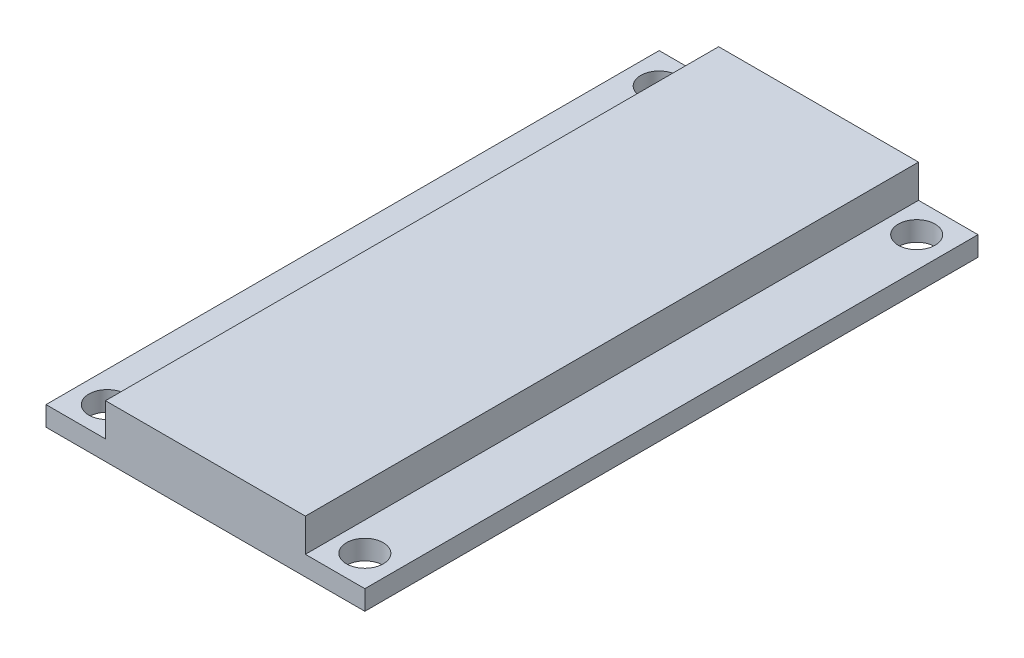
ISO-10303-21;
HEADER;
FILE_DESCRIPTION(('STEP AP214'),'2;1');
FILE_NAME('part.step','',(''),(''),'','','');
FILE_SCHEMA(('AUTOMOTIVE_DESIGN { 1 0 10303 214 1 1 1 1 }'));
ENDSEC;
DATA;
#1=APPLICATION_CONTEXT('core data for automotive mechanical design processes');
#2=APPLICATION_PROTOCOL_DEFINITION('international standard','automotive_design',2000,#1);
#3=PRODUCT_CONTEXT('',#1,'mechanical');
#4=PRODUCT('Part','Part','',(#3));
#5=PRODUCT_RELATED_PRODUCT_CATEGORY('part','',(#4));
#6=PRODUCT_DEFINITION_FORMATION('','',#4);
#7=PRODUCT_DEFINITION_CONTEXT('part definition',#1,'design');
#8=PRODUCT_DEFINITION('design','',#6,#7);
#9=PRODUCT_DEFINITION_SHAPE('','',#8);
#10=(LENGTH_UNIT() NAMED_UNIT(*) SI_UNIT(.MILLI.,.METRE.));
#11=(NAMED_UNIT(*) PLANE_ANGLE_UNIT() SI_UNIT($,.RADIAN.));
#12=(NAMED_UNIT(*) SI_UNIT($,.STERADIAN.) SOLID_ANGLE_UNIT());
#13=UNCERTAINTY_MEASURE_WITH_UNIT(LENGTH_MEASURE(1.E-05),#10,'distance_accuracy_value','');
#14=(GEOMETRIC_REPRESENTATION_CONTEXT(3) GLOBAL_UNCERTAINTY_ASSIGNED_CONTEXT((#13)) GLOBAL_UNIT_ASSIGNED_CONTEXT((#10,
#11,#12)) REPRESENTATION_CONTEXT('',''));
#15=CARTESIAN_POINT('',(0.,0.,0.));
#16=DIRECTION('',(0.,0.,1.));
#17=DIRECTION('',(1.,0.,0.));
#18=AXIS2_PLACEMENT_3D('',#15,#16,#17);
#19=CARTESIAN_POINT('',(0.,1.6,0.));
#20=DIRECTION('',(0.,-1.,0.));
#21=DIRECTION('',(0.,0.,-1.));
#22=AXIS2_PLACEMENT_3D('',#19,#20,#21);
#23=PLANE('',#22);
#24=CARTESIAN_POINT('',(2.5,1.6,-2.5));
#25=DIRECTION('',(0.,1.,0.));
#26=DIRECTION('',(0.,0.,1.));
#27=AXIS2_PLACEMENT_3D('',#24,#25,#26);
#28=CIRCLE('',#27,1.5);
#29=CARTESIAN_POINT('',(2.5,1.6,-1.));
#30=VERTEX_POINT('',#29);
#31=EDGE_CURVE('E138',#30,#30,#28,.T.);
#32=ORIENTED_EDGE('',*,*,#31,.F.);
#33=EDGE_LOOP('',(#32));
#34=FACE_BOUND('',#33,.T.);
#35=CARTESIAN_POINT('',(2.5,1.6,-47.5));
#36=DIRECTION('',(0.,1.,0.));
#37=DIRECTION('',(0.,0.,-1.));
#38=AXIS2_PLACEMENT_3D('',#35,#36,#37);
#39=CIRCLE('',#38,1.5);
#40=CARTESIAN_POINT('',(2.5,1.6,-49.));
#41=VERTEX_POINT('',#40);
#42=EDGE_CURVE('E126',#41,#41,#39,.T.);
#43=ORIENTED_EDGE('',*,*,#42,.F.);
#44=EDGE_LOOP('',(#43));
#45=FACE_BOUND('',#44,.T.);
#46=DIRECTION('',(0.,0.,1.));
#47=VECTOR('',#46,1.);
#48=CARTESIAN_POINT('',(4.85,1.6,-50.));
#49=LINE('',#48,#47);
#50=CARTESIAN_POINT('',(4.85,1.6,-50.));
#51=VERTEX_POINT('',#50);
#52=CARTESIAN_POINT('',(4.85,1.6,0.));
#53=VERTEX_POINT('',#52);
#54=EDGE_CURVE('E53',#51,#53,#49,.T.);
#55=ORIENTED_EDGE('',*,*,#54,.F.);
#56=DIRECTION('',(-1.,0.,0.));
#57=VECTOR('',#56,1.);
#58=CARTESIAN_POINT('',(0.,1.6,-50.));
#59=LINE('',#58,#57);
#60=CARTESIAN_POINT('',(0.,1.6,-50.));
#61=VERTEX_POINT('',#60);
#62=EDGE_CURVE('E168',#51,#61,#59,.T.);
#63=ORIENTED_EDGE('',*,*,#62,.T.);
#64=DIRECTION('',(0.,0.,1.));
#65=VECTOR('',#64,1.);
#66=CARTESIAN_POINT('',(0.,1.6,0.));
#67=LINE('',#66,#65);
#68=CARTESIAN_POINT('',(0.,1.6,0.));
#69=VERTEX_POINT('',#68);
#70=EDGE_CURVE('E158',#61,#69,#67,.T.);
#71=ORIENTED_EDGE('',*,*,#70,.T.);
#72=DIRECTION('',(1.,0.,0.));
#73=VECTOR('',#72,1.);
#74=CARTESIAN_POINT('',(0.,1.6,0.));
#75=LINE('',#74,#73);
#76=EDGE_CURVE('E163',#69,#53,#75,.T.);
#77=ORIENTED_EDGE('',*,*,#76,.T.);
#78=EDGE_LOOP('',(#55,#63,#71,#77));
#79=FACE_BOUND('',#78,.T.);
#80=ADVANCED_FACE('F38',(#34,#45,#79),#23,.F.);
#81=CARTESIAN_POINT('',(23.5,1.6,-2.5));
#82=DIRECTION('',(0.,1.,0.));
#83=DIRECTION('',(0.,0.,-1.));
#84=AXIS2_PLACEMENT_3D('',#81,#82,#83);
#85=CIRCLE('',#84,1.5);
#86=CARTESIAN_POINT('',(23.5,1.6,-4.));
#87=VERTEX_POINT('',#86);
#88=EDGE_CURVE('E139',#87,#87,#85,.T.);
#89=ORIENTED_EDGE('',*,*,#88,.F.);
#90=EDGE_LOOP('',(#89));
#91=FACE_BOUND('',#90,.T.);
#92=CARTESIAN_POINT('',(23.5,1.6,-47.5));
#93=DIRECTION('',(0.,1.,0.));
#94=DIRECTION('',(0.,0.,1.));
#95=AXIS2_PLACEMENT_3D('',#92,#93,#94);
#96=CIRCLE('',#95,1.5);
#97=CARTESIAN_POINT('',(23.5,1.6,-46.));
#98=VERTEX_POINT('',#97);
#99=EDGE_CURVE('E146',#98,#98,#96,.T.);
#100=ORIENTED_EDGE('',*,*,#99,.F.);
#101=EDGE_LOOP('',(#100));
#102=FACE_BOUND('',#101,.T.);
#103=DIRECTION('',(0.,0.,-1.));
#104=VECTOR('',#103,1.);
#105=CARTESIAN_POINT('',(21.15,1.6,-50.));
#106=LINE('',#105,#104);
#107=CARTESIAN_POINT('',(21.15,1.6,0.));
#108=VERTEX_POINT('',#107);
#109=CARTESIAN_POINT('',(21.15,1.6,-50.));
#110=VERTEX_POINT('',#109);
#111=EDGE_CURVE('E61',#108,#110,#106,.T.);
#112=ORIENTED_EDGE('',*,*,#111,.F.);
#113=CARTESIAN_POINT('',(26.,1.6,0.));
#114=VERTEX_POINT('',#113);
#115=EDGE_CURVE('E161',#108,#114,#75,.T.);
#116=ORIENTED_EDGE('',*,*,#115,.T.);
#117=DIRECTION('',(0.,0.,-1.));
#118=VECTOR('',#117,1.);
#119=CARTESIAN_POINT('',(26.,1.6,0.));
#120=LINE('',#119,#118);
#121=CARTESIAN_POINT('',(26.,1.6,-50.));
#122=VERTEX_POINT('',#121);
#123=EDGE_CURVE('E165',#114,#122,#120,.T.);
#124=ORIENTED_EDGE('',*,*,#123,.T.);
#125=EDGE_CURVE('E169',#122,#110,#59,.T.);
#126=ORIENTED_EDGE('',*,*,#125,.T.);
#127=EDGE_LOOP('',(#112,#116,#124,#126));
#128=FACE_BOUND('',#127,.T.);
#129=ADVANCED_FACE('F217',(#91,#102,#128),#23,.F.);
#130=CARTESIAN_POINT('',(0.,1.6,0.));
#131=DIRECTION('',(1.,0.,0.));
#132=DIRECTION('',(0.,0.,-1.));
#133=AXIS2_PLACEMENT_3D('',#130,#131,#132);
#134=PLANE('',#133);
#135=DIRECTION('',(0.,0.,1.));
#136=VECTOR('',#135,1.);
#137=CARTESIAN_POINT('',(0.,0.,0.));
#138=LINE('',#137,#136);
#139=CARTESIAN_POINT('',(0.,0.,-50.));
#140=VERTEX_POINT('',#139);
#141=CARTESIAN_POINT('',(0.,0.,0.));
#142=VERTEX_POINT('',#141);
#143=EDGE_CURVE('E155',#140,#142,#138,.T.);
#144=ORIENTED_EDGE('',*,*,#143,.T.);
#145=DIRECTION('',(0.,-1.,0.));
#146=VECTOR('',#145,1.);
#147=CARTESIAN_POINT('',(0.,1.6,0.));
#148=LINE('',#147,#146);
#149=EDGE_CURVE('E11',#69,#142,#148,.T.);
#150=ORIENTED_EDGE('',*,*,#149,.F.);
#151=ORIENTED_EDGE('',*,*,#70,.F.);
#152=DIRECTION('',(0.,-1.,0.));
#153=VECTOR('',#152,1.);
#154=CARTESIAN_POINT('',(0.,1.6,-50.));
#155=LINE('',#154,#153);
#156=EDGE_CURVE('E172',#61,#140,#155,.T.);
#157=ORIENTED_EDGE('',*,*,#156,.T.);
#158=EDGE_LOOP('',(#144,#150,#151,#157));
#159=FACE_BOUND('',#158,.T.);
#160=ADVANCED_FACE('F40',(#159),#134,.F.);
#161=CARTESIAN_POINT('',(0.,1.6,0.));
#162=DIRECTION('',(0.,0.,-1.));
#163=DIRECTION('',(-1.,0.,0.));
#164=AXIS2_PLACEMENT_3D('',#161,#162,#163);
#165=PLANE('',#164);
#166=DIRECTION('',(1.,0.,0.));
#167=VECTOR('',#166,1.);
#168=CARTESIAN_POINT('',(0.,0.,0.));
#169=LINE('',#168,#167);
#170=CARTESIAN_POINT('',(26.,0.,0.));
#171=VERTEX_POINT('',#170);
#172=EDGE_CURVE('E175',#142,#171,#169,.T.);
#173=ORIENTED_EDGE('',*,*,#172,.T.);
#174=DIRECTION('',(0.,-1.,0.));
#175=VECTOR('',#174,1.);
#176=CARTESIAN_POINT('',(26.,1.6,0.));
#177=LINE('',#176,#175);
#178=EDGE_CURVE('E46',#114,#171,#177,.T.);
#179=ORIENTED_EDGE('',*,*,#178,.F.);
#180=ORIENTED_EDGE('',*,*,#115,.F.);
#181=DIRECTION('',(0.,-1.,0.));
#182=VECTOR('',#181,1.);
#183=CARTESIAN_POINT('',(21.15,4.3,0.));
#184=LINE('',#183,#182);
#185=CARTESIAN_POINT('',(21.15,4.3,0.));
#186=VERTEX_POINT('',#185);
#187=EDGE_CURVE('E111',#186,#108,#184,.T.);
#188=ORIENTED_EDGE('',*,*,#187,.F.);
#189=DIRECTION('',(1.,0.,0.));
#190=VECTOR('',#189,1.);
#191=CARTESIAN_POINT('',(21.15,4.3,0.));
#192=LINE('',#191,#190);
#193=CARTESIAN_POINT('',(4.85,4.3,0.));
#194=VERTEX_POINT('',#193);
#195=EDGE_CURVE('E105',#194,#186,#192,.T.);
#196=ORIENTED_EDGE('',*,*,#195,.F.);
#197=DIRECTION('',(0.,-1.,0.));
#198=VECTOR('',#197,1.);
#199=CARTESIAN_POINT('',(4.85,4.3,0.));
#200=LINE('',#199,#198);
#201=EDGE_CURVE('E109',#194,#53,#200,.T.);
#202=ORIENTED_EDGE('',*,*,#201,.T.);
#203=ORIENTED_EDGE('',*,*,#76,.F.);
#204=ORIENTED_EDGE('',*,*,#149,.T.);
#205=EDGE_LOOP('',(#173,#179,#180,#188,#196,#202,#203,#204));
#206=FACE_BOUND('',#205,.T.);
#207=ADVANCED_FACE('F107',(#206),#165,.F.);
#208=CARTESIAN_POINT('',(26.,1.6,0.));
#209=DIRECTION('',(-1.,0.,0.));
#210=DIRECTION('',(0.,0.,1.));
#211=AXIS2_PLACEMENT_3D('',#208,#209,#210);
#212=PLANE('',#211);
#213=DIRECTION('',(0.,0.,-1.));
#214=VECTOR('',#213,1.);
#215=CARTESIAN_POINT('',(26.,0.,0.));
#216=LINE('',#215,#214);
#217=CARTESIAN_POINT('',(26.,0.,-50.));
#218=VERTEX_POINT('',#217);
#219=EDGE_CURVE('E177',#171,#218,#216,.T.);
#220=ORIENTED_EDGE('',*,*,#219,.T.);
#221=DIRECTION('',(0.,-1.,0.));
#222=VECTOR('',#221,1.);
#223=CARTESIAN_POINT('',(26.,1.6,-50.));
#224=LINE('',#223,#222);
#225=EDGE_CURVE('E184',#122,#218,#224,.T.);
#226=ORIENTED_EDGE('',*,*,#225,.F.);
#227=ORIENTED_EDGE('',*,*,#123,.F.);
#228=ORIENTED_EDGE('',*,*,#178,.T.);
#229=EDGE_LOOP('',(#220,#226,#227,#228));
#230=FACE_BOUND('',#229,.T.);
#231=ADVANCED_FACE('F192',(#230),#212,.F.);
#232=CARTESIAN_POINT('',(0.,1.6,-50.));
#233=DIRECTION('',(0.,0.,1.));
#234=DIRECTION('',(1.,0.,0.));
#235=AXIS2_PLACEMENT_3D('',#232,#233,#234);
#236=PLANE('',#235);
#237=DIRECTION('',(-1.,0.,0.));
#238=VECTOR('',#237,1.);
#239=CARTESIAN_POINT('',(0.,0.,-50.));
#240=LINE('',#239,#238);
#241=EDGE_CURVE('E162',#218,#140,#240,.T.);
#242=ORIENTED_EDGE('',*,*,#241,.T.);
#243=ORIENTED_EDGE('',*,*,#156,.F.);
#244=ORIENTED_EDGE('',*,*,#62,.F.);
#245=DIRECTION('',(0.,-1.,0.));
#246=VECTOR('',#245,1.);
#247=CARTESIAN_POINT('',(4.85,4.3,-50.));
#248=LINE('',#247,#246);
#249=CARTESIAN_POINT('',(4.85,4.3,-50.));
#250=VERTEX_POINT('',#249);
#251=EDGE_CURVE('E205',#250,#51,#248,.T.);
#252=ORIENTED_EDGE('',*,*,#251,.F.);
#253=DIRECTION('',(-1.,0.,0.));
#254=VECTOR('',#253,1.);
#255=CARTESIAN_POINT('',(21.15,4.3,-50.));
#256=LINE('',#255,#254);
#257=CARTESIAN_POINT('',(21.15,4.3,-50.));
#258=VERTEX_POINT('',#257);
#259=EDGE_CURVE('E120',#258,#250,#256,.T.);
#260=ORIENTED_EDGE('',*,*,#259,.F.);
#261=DIRECTION('',(0.,-1.,0.));
#262=VECTOR('',#261,1.);
#263=CARTESIAN_POINT('',(21.15,4.3,-50.));
#264=LINE('',#263,#262);
#265=EDGE_CURVE('E131',#258,#110,#264,.T.);
#266=ORIENTED_EDGE('',*,*,#265,.T.);
#267=ORIENTED_EDGE('',*,*,#125,.F.);
#268=ORIENTED_EDGE('',*,*,#225,.T.);
#269=EDGE_LOOP('',(#242,#243,#244,#252,#260,#266,#267,#268));
#270=FACE_BOUND('',#269,.T.);
#271=ADVANCED_FACE('F200',(#270),#236,.F.);
#272=CARTESIAN_POINT('',(0.,0.,0.));
#273=DIRECTION('',(0.,-1.,0.));
#274=DIRECTION('',(0.,0.,-1.));
#275=AXIS2_PLACEMENT_3D('',#272,#273,#274);
#276=PLANE('',#275);
#277=CARTESIAN_POINT('',(2.5,0.,-47.5));
#278=DIRECTION('',(0.,1.,0.));
#279=DIRECTION('',(0.,0.,-1.));
#280=AXIS2_PLACEMENT_3D('',#277,#278,#279);
#281=CIRCLE('',#280,1.5);
#282=CARTESIAN_POINT('',(2.5,0.,-49.));
#283=VERTEX_POINT('',#282);
#284=EDGE_CURVE('E129',#283,#283,#281,.T.);
#285=ORIENTED_EDGE('',*,*,#284,.T.);
#286=EDGE_LOOP('',(#285));
#287=FACE_BOUND('',#286,.T.);
#288=CARTESIAN_POINT('',(23.5,0.,-47.5));
#289=DIRECTION('',(0.,1.,0.));
#290=DIRECTION('',(0.,0.,1.));
#291=AXIS2_PLACEMENT_3D('',#288,#289,#290);
#292=CIRCLE('',#291,1.5);
#293=CARTESIAN_POINT('',(23.5,0.,-46.));
#294=VERTEX_POINT('',#293);
#295=EDGE_CURVE('E142',#294,#294,#292,.T.);
#296=ORIENTED_EDGE('',*,*,#295,.T.);
#297=EDGE_LOOP('',(#296));
#298=FACE_BOUND('',#297,.T.);
#299=CARTESIAN_POINT('',(23.5,0.,-2.5));
#300=DIRECTION('',(0.,1.,0.));
#301=DIRECTION('',(0.,0.,-1.));
#302=AXIS2_PLACEMENT_3D('',#299,#300,#301);
#303=CIRCLE('',#302,1.5);
#304=CARTESIAN_POINT('',(23.5,0.,-4.));
#305=VERTEX_POINT('',#304);
#306=EDGE_CURVE('E135',#305,#305,#303,.T.);
#307=ORIENTED_EDGE('',*,*,#306,.T.);
#308=EDGE_LOOP('',(#307));
#309=FACE_BOUND('',#308,.T.);
#310=CARTESIAN_POINT('',(2.5,0.,-2.5));
#311=DIRECTION('',(0.,1.,0.));
#312=DIRECTION('',(0.,0.,1.));
#313=AXIS2_PLACEMENT_3D('',#310,#311,#312);
#314=CIRCLE('',#313,1.5);
#315=CARTESIAN_POINT('',(2.5,0.,-1.));
#316=VERTEX_POINT('',#315);
#317=EDGE_CURVE('E152',#316,#316,#314,.T.);
#318=ORIENTED_EDGE('',*,*,#317,.T.);
#319=EDGE_LOOP('',(#318));
#320=FACE_BOUND('',#319,.T.);
#321=ORIENTED_EDGE('',*,*,#143,.F.);
#322=ORIENTED_EDGE('',*,*,#241,.F.);
#323=ORIENTED_EDGE('',*,*,#219,.F.);
#324=ORIENTED_EDGE('',*,*,#172,.F.);
#325=EDGE_LOOP('',(#321,#322,#323,#324));
#326=FACE_BOUND('',#325,.T.);
#327=ADVANCED_FACE('F197',(#287,#298,#309,#320,#326),#276,.T.);
#328=CARTESIAN_POINT('',(2.5,0.,-2.5));
#329=DIRECTION('',(0.,1.,0.));
#330=DIRECTION('',(0.,0.,1.));
#331=AXIS2_PLACEMENT_3D('',#328,#329,#330);
#332=CYLINDRICAL_SURFACE('',#331,1.5);
#333=ORIENTED_EDGE('',*,*,#317,.F.);
#334=EDGE_LOOP('',(#333));
#335=FACE_BOUND('',#334,.T.);
#336=ORIENTED_EDGE('',*,*,#31,.T.);
#337=EDGE_LOOP('',(#336));
#338=FACE_BOUND('',#337,.T.);
#339=ADVANCED_FACE('F230',(#335,#338),#332,.F.);
#340=CARTESIAN_POINT('',(23.5,0.,-2.5));
#341=DIRECTION('',(0.,1.,0.));
#342=DIRECTION('',(0.,0.,1.));
#343=AXIS2_PLACEMENT_3D('',#340,#341,#342);
#344=CYLINDRICAL_SURFACE('',#343,1.5);
#345=ORIENTED_EDGE('',*,*,#306,.F.);
#346=EDGE_LOOP('',(#345));
#347=FACE_BOUND('',#346,.T.);
#348=ORIENTED_EDGE('',*,*,#88,.T.);
#349=EDGE_LOOP('',(#348));
#350=FACE_BOUND('',#349,.T.);
#351=ADVANCED_FACE('F262',(#347,#350),#344,.F.);
#352=CARTESIAN_POINT('',(23.5,0.,-47.5));
#353=DIRECTION('',(0.,1.,0.));
#354=DIRECTION('',(0.,0.,1.));
#355=AXIS2_PLACEMENT_3D('',#352,#353,#354);
#356=CYLINDRICAL_SURFACE('',#355,1.5);
#357=ORIENTED_EDGE('',*,*,#295,.F.);
#358=EDGE_LOOP('',(#357));
#359=FACE_BOUND('',#358,.T.);
#360=ORIENTED_EDGE('',*,*,#99,.T.);
#361=EDGE_LOOP('',(#360));
#362=FACE_BOUND('',#361,.T.);
#363=ADVANCED_FACE('F269',(#359,#362),#356,.F.);
#364=CARTESIAN_POINT('',(2.5,0.,-47.5));
#365=DIRECTION('',(0.,1.,0.));
#366=DIRECTION('',(0.,0.,1.));
#367=AXIS2_PLACEMENT_3D('',#364,#365,#366);
#368=CYLINDRICAL_SURFACE('',#367,1.5);
#369=ORIENTED_EDGE('',*,*,#284,.F.);
#370=EDGE_LOOP('',(#369));
#371=FACE_BOUND('',#370,.T.);
#372=ORIENTED_EDGE('',*,*,#42,.T.);
#373=EDGE_LOOP('',(#372));
#374=FACE_BOUND('',#373,.T.);
#375=ADVANCED_FACE('F277',(#371,#374),#368,.F.);
#376=CARTESIAN_POINT('',(4.85,4.3,-50.));
#377=DIRECTION('',(1.,0.,0.));
#378=DIRECTION('',(0.,0.,-1.));
#379=AXIS2_PLACEMENT_3D('',#376,#377,#378);
#380=PLANE('',#379);
#381=ORIENTED_EDGE('',*,*,#54,.T.);
#382=ORIENTED_EDGE('',*,*,#201,.F.);
#383=DIRECTION('',(0.,0.,1.));
#384=VECTOR('',#383,1.);
#385=CARTESIAN_POINT('',(4.85,4.3,-50.));
#386=LINE('',#385,#384);
#387=EDGE_CURVE('E115',#250,#194,#386,.T.);
#388=ORIENTED_EDGE('',*,*,#387,.F.);
#389=ORIENTED_EDGE('',*,*,#251,.T.);
#390=EDGE_LOOP('',(#381,#382,#388,#389));
#391=FACE_BOUND('',#390,.T.);
#392=ADVANCED_FACE('F125',(#391),#380,.F.);
#393=CARTESIAN_POINT('',(21.15,4.3,-50.));
#394=DIRECTION('',(-1.,0.,0.));
#395=DIRECTION('',(0.,0.,1.));
#396=AXIS2_PLACEMENT_3D('',#393,#394,#395);
#397=PLANE('',#396);
#398=ORIENTED_EDGE('',*,*,#111,.T.);
#399=ORIENTED_EDGE('',*,*,#265,.F.);
#400=DIRECTION('',(0.,0.,-1.));
#401=VECTOR('',#400,1.);
#402=CARTESIAN_POINT('',(21.15,4.3,-50.));
#403=LINE('',#402,#401);
#404=EDGE_CURVE('E114',#186,#258,#403,.T.);
#405=ORIENTED_EDGE('',*,*,#404,.F.);
#406=ORIENTED_EDGE('',*,*,#187,.T.);
#407=EDGE_LOOP('',(#398,#399,#405,#406));
#408=FACE_BOUND('',#407,.T.);
#409=ADVANCED_FACE('F216',(#408),#397,.F.);
#410=CARTESIAN_POINT('',(0.,4.3,0.));
#411=DIRECTION('',(0.,-1.,0.));
#412=DIRECTION('',(0.,0.,-1.));
#413=AXIS2_PLACEMENT_3D('',#410,#411,#412);
#414=PLANE('',#413);
#415=ORIENTED_EDGE('',*,*,#387,.T.);
#416=ORIENTED_EDGE('',*,*,#195,.T.);
#417=ORIENTED_EDGE('',*,*,#404,.T.);
#418=ORIENTED_EDGE('',*,*,#259,.T.);
#419=EDGE_LOOP('',(#415,#416,#417,#418));
#420=FACE_BOUND('',#419,.T.);
#421=ADVANCED_FACE('F118',(#420),#414,.F.);
#422=CLOSED_SHELL('',(#80,#129,#160,#207,#231,#271,#327,#339,#351,#363,#375,#392,#409,#421));
#423=MANIFOLD_SOLID_BREP('B2',#422);
#424=ADVANCED_BREP_SHAPE_REPRESENTATION('',(#18,#423),#14);
#425=SHAPE_DEFINITION_REPRESENTATION(#9,#424);
ENDSEC;
END-ISO-10303-21;
